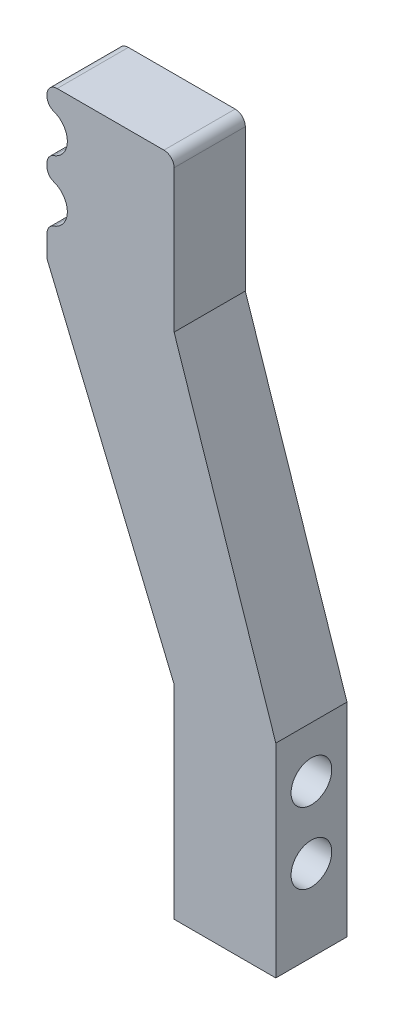
ISO-10303-21;
HEADER;
FILE_DESCRIPTION(('STEP AP214'),'2;1');
FILE_NAME('part.step','',(''),(''),'','','');
FILE_SCHEMA(('AUTOMOTIVE_DESIGN { 1 0 10303 214 1 1 1 1 }'));
ENDSEC;
DATA;
#1=APPLICATION_CONTEXT('core data for automotive mechanical design processes');
#2=APPLICATION_PROTOCOL_DEFINITION('international standard','automotive_design',2000,#1);
#3=PRODUCT_CONTEXT('',#1,'mechanical');
#4=PRODUCT('Part','Part','',(#3));
#5=PRODUCT_RELATED_PRODUCT_CATEGORY('part','',(#4));
#6=PRODUCT_DEFINITION_FORMATION('','',#4);
#7=PRODUCT_DEFINITION_CONTEXT('part definition',#1,'design');
#8=PRODUCT_DEFINITION('design','',#6,#7);
#9=PRODUCT_DEFINITION_SHAPE('','',#8);
#10=(LENGTH_UNIT() NAMED_UNIT(*) SI_UNIT(.MILLI.,.METRE.));
#11=(NAMED_UNIT(*) PLANE_ANGLE_UNIT() SI_UNIT($,.RADIAN.));
#12=(NAMED_UNIT(*) SI_UNIT($,.STERADIAN.) SOLID_ANGLE_UNIT());
#13=UNCERTAINTY_MEASURE_WITH_UNIT(LENGTH_MEASURE(1.E-05),#10,'distance_accuracy_value','');
#14=(GEOMETRIC_REPRESENTATION_CONTEXT(3) GLOBAL_UNCERTAINTY_ASSIGNED_CONTEXT((#13)) GLOBAL_UNIT_ASSIGNED_CONTEXT((#10,
#11,#12)) REPRESENTATION_CONTEXT('',''));
#15=CARTESIAN_POINT('',(0.,0.,0.));
#16=DIRECTION('',(0.,0.,1.));
#17=DIRECTION('',(1.,0.,0.));
#18=AXIS2_PLACEMENT_3D('',#15,#16,#17);
#19=CARTESIAN_POINT('',(-225.084321869179,779.298857863969,70.));
#20=DIRECTION('',(1.,0.,0.));
#21=DIRECTION('',(0.,0.,-1.));
#22=AXIS2_PLACEMENT_3D('',#19,#20,#21);
#23=PLANE('',#22);
#24=DIRECTION('',(0.,0.,1.));
#25=VECTOR('',#24,1.);
#26=CARTESIAN_POINT('',(-225.084321869179,777.583129111431,-122.));
#27=LINE('',#26,#25);
#28=CARTESIAN_POINT('',(-225.084321869179,777.583129111431,0.));
#29=VERTEX_POINT('',#28);
#30=CARTESIAN_POINT('',(-225.084321869179,777.583129111431,70.));
#31=VERTEX_POINT('',#30);
#32=EDGE_CURVE('E311',#29,#31,#27,.T.);
#33=ORIENTED_EDGE('',*,*,#32,.T.);
#34=DIRECTION('',(0.,-1.,0.));
#35=VECTOR('',#34,1.);
#36=CARTESIAN_POINT('',(-225.084321869179,779.298857863969,70.));
#37=LINE('',#36,#35);
#38=CARTESIAN_POINT('',(-225.084321869179,779.298857863969,70.));
#39=VERTEX_POINT('',#38);
#40=EDGE_CURVE('E188',#39,#31,#37,.T.);
#41=ORIENTED_EDGE('',*,*,#40,.F.);
#42=DIRECTION('',(0.,0.,-1.));
#43=VECTOR('',#42,1.);
#44=CARTESIAN_POINT('',(-225.084321869179,779.298857863969,70.));
#45=LINE('',#44,#43);
#46=CARTESIAN_POINT('',(-225.084321869179,779.298857863969,0.));
#47=VERTEX_POINT('',#46);
#48=EDGE_CURVE('E255',#39,#47,#45,.T.);
#49=ORIENTED_EDGE('',*,*,#48,.T.);
#50=DIRECTION('',(0.,-1.,0.));
#51=VECTOR('',#50,1.);
#52=CARTESIAN_POINT('',(-225.084321869179,779.298857863969,0.));
#53=LINE('',#52,#51);
#54=EDGE_CURVE('E218',#47,#29,#53,.T.);
#55=ORIENTED_EDGE('',*,*,#54,.T.);
#56=EDGE_LOOP('',(#33,#41,#49,#55));
#57=FACE_BOUND('',#56,.T.);
#58=ADVANCED_FACE('F39',(#57),#23,.F.);
#59=CARTESIAN_POINT('',(-225.084321869179,721.014586616507,70.));
#60=VERTEX_POINT('',#59);
#61=CARTESIAN_POINT('',(-225.084321869179,717.583129111431,70.));
#62=VERTEX_POINT('',#61);
#63=EDGE_CURVE('E180',#60,#62,#37,.T.);
#64=ORIENTED_EDGE('',*,*,#63,.F.);
#65=DIRECTION('',(0.,0.,1.));
#66=VECTOR('',#65,1.);
#67=CARTESIAN_POINT('',(-225.084321869179,721.014586616507,-122.));
#68=LINE('',#67,#66);
#69=CARTESIAN_POINT('',(-225.084321869179,721.014586616507,0.));
#70=VERTEX_POINT('',#69);
#71=EDGE_CURVE('E162',#70,#60,#68,.T.);
#72=ORIENTED_EDGE('',*,*,#71,.F.);
#73=CARTESIAN_POINT('',(-225.084321869179,717.583129111431,0.));
#74=VERTEX_POINT('',#73);
#75=EDGE_CURVE('E222',#70,#74,#53,.T.);
#76=ORIENTED_EDGE('',*,*,#75,.T.);
#77=DIRECTION('',(0.,0.,1.));
#78=VECTOR('',#77,1.);
#79=CARTESIAN_POINT('',(-225.084321869179,717.583129111431,-122.));
#80=LINE('',#79,#78);
#81=EDGE_CURVE('E187',#74,#62,#80,.T.);
#82=ORIENTED_EDGE('',*,*,#81,.T.);
#83=EDGE_LOOP('',(#64,#72,#76,#82));
#84=FACE_BOUND('',#83,.T.);
#85=ADVANCED_FACE('F186',(#84),#23,.F.);
#86=CARTESIAN_POINT('',(-110.084321869179,779.298857863969,70.));
#87=DIRECTION('',(0.,0.,1.));
#88=DIRECTION('',(1.,0.,0.));
#89=AXIS2_PLACEMENT_3D('',#86,#87,#88);
#90=PLANE('',#89);
#91=CARTESIAN_POINT('',(-215.084321869179,777.583129111431,70.));
#92=DIRECTION('',(0.,0.,-1.));
#93=DIRECTION('',(-1.,0.,0.));
#94=AXIS2_PLACEMENT_3D('',#91,#92,#93);
#95=CIRCLE('',#94,9.99999999999999);
#96=CARTESIAN_POINT('',(-218.417655202512,768.15503869561,70.));
#97=VERTEX_POINT('',#96);
#98=EDGE_CURVE('E314',#97,#31,#95,.T.);
#99=ORIENTED_EDGE('',*,*,#98,.F.);
#100=CARTESIAN_POINT('',(-225.084321869179,749.298857863969,70.));
#101=DIRECTION('',(0.,0.,1.));
#102=DIRECTION('',(1.,0.,0.));
#103=AXIS2_PLACEMENT_3D('',#100,#101,#102);
#104=CIRCLE('',#103,20.);
#105=CARTESIAN_POINT('',(-218.417655202513,730.442677032328,70.));
#106=VERTEX_POINT('',#105);
#107=EDGE_CURVE('E182',#106,#97,#104,.T.);
#108=ORIENTED_EDGE('',*,*,#107,.F.);
#109=CARTESIAN_POINT('',(-215.084321869179,721.014586616507,70.));
#110=DIRECTION('',(0.,0.,-1.));
#111=DIRECTION('',(-1.,0.,0.));
#112=AXIS2_PLACEMENT_3D('',#109,#110,#111);
#113=CIRCLE('',#112,9.99999999999999);
#114=EDGE_CURVE('E165',#60,#106,#113,.T.);
#115=ORIENTED_EDGE('',*,*,#114,.F.);
#116=ORIENTED_EDGE('',*,*,#63,.T.);
#117=CARTESIAN_POINT('',(-215.084321869179,717.583129111431,70.));
#118=DIRECTION('',(0.,0.,-1.));
#119=DIRECTION('',(-1.,0.,0.));
#120=AXIS2_PLACEMENT_3D('',#117,#118,#119);
#121=CIRCLE('',#120,9.99999999999999);
#122=CARTESIAN_POINT('',(-218.417655202512,708.15503869561,70.));
#123=VERTEX_POINT('',#122);
#124=EDGE_CURVE('E183',#123,#62,#121,.T.);
#125=ORIENTED_EDGE('',*,*,#124,.F.);
#126=CARTESIAN_POINT('',(-225.084321869179,689.298857863969,70.));
#127=DIRECTION('',(0.,0.,1.));
#128=DIRECTION('',(1.,0.,0.));
#129=AXIS2_PLACEMENT_3D('',#126,#127,#128);
#130=CIRCLE('',#129,20.);
#131=CARTESIAN_POINT('',(-218.417655202513,670.442677032328,70.));
#132=VERTEX_POINT('',#131);
#133=EDGE_CURVE('E279',#132,#123,#130,.T.);
#134=ORIENTED_EDGE('',*,*,#133,.F.);
#135=CARTESIAN_POINT('',(-215.084321869179,661.014586616507,70.));
#136=DIRECTION('',(0.,0.,-1.));
#137=DIRECTION('',(-1.,0.,0.));
#138=AXIS2_PLACEMENT_3D('',#135,#136,#137);
#139=CIRCLE('',#138,10.);
#140=CARTESIAN_POINT('',(-225.084321869179,661.014586616507,70.));
#141=VERTEX_POINT('',#140);
#142=EDGE_CURVE('E62',#141,#132,#139,.T.);
#143=ORIENTED_EDGE('',*,*,#142,.F.);
#144=CARTESIAN_POINT('',(-225.084321869179,639.298857863969,70.));
#145=VERTEX_POINT('',#144);
#146=EDGE_CURVE('E189',#141,#145,#37,.T.);
#147=ORIENTED_EDGE('',*,*,#146,.T.);
#148=DIRECTION('',(0.384615384615385,-0.923076923076923,0.));
#149=VECTOR('',#148,1.);
#150=CARTESIAN_POINT('',(-100.084321869179,339.298857863969,70.));
#151=LINE('',#150,#149);
#152=CARTESIAN_POINT('',(-100.084321869179,339.298857863969,70.));
#153=VERTEX_POINT('',#152);
#154=EDGE_CURVE('E192',#145,#153,#151,.T.);
#155=ORIENTED_EDGE('',*,*,#154,.T.);
#156=DIRECTION('',(0.,-1.,0.));
#157=VECTOR('',#156,1.);
#158=CARTESIAN_POINT('',(-100.084321869179,339.298857863969,70.));
#159=LINE('',#158,#157);
#160=CARTESIAN_POINT('',(-100.084321869179,139.298857863969,70.));
#161=VERTEX_POINT('',#160);
#162=EDGE_CURVE('E198',#153,#161,#159,.T.);
#163=ORIENTED_EDGE('',*,*,#162,.T.);
#164=DIRECTION('',(1.,0.,0.));
#165=VECTOR('',#164,1.);
#166=CARTESIAN_POINT('',(-0.0843218691791159,139.298857863969,70.));
#167=LINE('',#166,#165);
#168=CARTESIAN_POINT('',(-0.0843218691791159,139.298857863969,70.));
#169=VERTEX_POINT('',#168);
#170=EDGE_CURVE('E200',#161,#169,#167,.T.);
#171=ORIENTED_EDGE('',*,*,#170,.T.);
#172=DIRECTION('',(0.,1.,0.));
#173=VECTOR('',#172,1.);
#174=CARTESIAN_POINT('',(-0.0843218691791426,339.298857863969,70.));
#175=LINE('',#174,#173);
#176=CARTESIAN_POINT('',(-0.0843218691791426,339.298857863969,70.));
#177=VERTEX_POINT('',#176);
#178=EDGE_CURVE('E202',#169,#177,#175,.T.);
#179=ORIENTED_EDGE('',*,*,#178,.T.);
#180=DIRECTION('',(-0.316227766016838,0.948683298050514,0.));
#181=VECTOR('',#180,1.);
#182=CARTESIAN_POINT('',(-0.0843218691791426,339.298857863969,70.));
#183=LINE('',#182,#181);
#184=CARTESIAN_POINT('',(-100.084321869179,639.298857863969,70.));
#185=VERTEX_POINT('',#184);
#186=EDGE_CURVE('E204',#177,#185,#183,.T.);
#187=ORIENTED_EDGE('',*,*,#186,.T.);
#188=DIRECTION('',(0.,1.,0.));
#189=VECTOR('',#188,1.);
#190=CARTESIAN_POINT('',(-100.084321869179,779.298857863969,70.));
#191=LINE('',#190,#189);
#192=CARTESIAN_POINT('',(-100.084321869179,779.298857863969,70.));
#193=VERTEX_POINT('',#192);
#194=EDGE_CURVE('E206',#185,#193,#191,.T.);
#195=ORIENTED_EDGE('',*,*,#194,.T.);
#196=CARTESIAN_POINT('',(-110.084321869179,779.298857863969,70.));
#197=DIRECTION('',(0.,0.,1.));
#198=DIRECTION('',(1.,0.,0.));
#199=AXIS2_PLACEMENT_3D('',#196,#197,#198);
#200=CIRCLE('',#199,10.);
#201=CARTESIAN_POINT('',(-110.084321869179,789.298857863969,70.));
#202=VERTEX_POINT('',#201);
#203=EDGE_CURVE('E234',#193,#202,#200,.T.);
#204=ORIENTED_EDGE('',*,*,#203,.T.);
#205=DIRECTION('',(-1.,0.,0.));
#206=VECTOR('',#205,1.);
#207=CARTESIAN_POINT('',(-215.084321869179,789.298857863969,70.));
#208=LINE('',#207,#206);
#209=CARTESIAN_POINT('',(-215.084321869179,789.298857863969,70.));
#210=VERTEX_POINT('',#209);
#211=EDGE_CURVE('E300',#202,#210,#208,.T.);
#212=ORIENTED_EDGE('',*,*,#211,.T.);
#213=CARTESIAN_POINT('',(-215.084321869179,779.298857863969,70.));
#214=DIRECTION('',(0.,0.,1.));
#215=DIRECTION('',(-1.,0.,0.));
#216=AXIS2_PLACEMENT_3D('',#213,#214,#215);
#217=CIRCLE('',#216,10.);
#218=EDGE_CURVE('E193',#210,#39,#217,.T.);
#219=ORIENTED_EDGE('',*,*,#218,.T.);
#220=ORIENTED_EDGE('',*,*,#40,.T.);
#221=EDGE_LOOP('',(#99,#108,#115,#116,#125,#134,#143,#147,#155,#163,#171,#179,#187,#195,#204,
#212,#219,#220));
#222=FACE_BOUND('',#221,.T.);
#223=ADVANCED_FACE('F178',(#222),#90,.T.);
#224=CARTESIAN_POINT('',(-110.084321869179,779.298857863969,0.));
#225=DIRECTION('',(0.,0.,1.));
#226=DIRECTION('',(1.,0.,0.));
#227=AXIS2_PLACEMENT_3D('',#224,#225,#226);
#228=PLANE('',#227);
#229=CARTESIAN_POINT('',(-225.084321869179,749.298857863969,0.));
#230=DIRECTION('',(0.,0.,1.));
#231=DIRECTION('',(1.,0.,0.));
#232=AXIS2_PLACEMENT_3D('',#229,#230,#231);
#233=CIRCLE('',#232,20.);
#234=CARTESIAN_POINT('',(-218.417655202512,730.442677032328,0.));
#235=VERTEX_POINT('',#234);
#236=CARTESIAN_POINT('',(-218.417655202513,768.15503869561,0.));
#237=VERTEX_POINT('',#236);
#238=EDGE_CURVE('E267',#235,#237,#233,.T.);
#239=ORIENTED_EDGE('',*,*,#238,.T.);
#240=CARTESIAN_POINT('',(-215.084321869179,777.583129111431,0.));
#241=DIRECTION('',(0.,0.,1.));
#242=DIRECTION('',(1.,0.,0.));
#243=AXIS2_PLACEMENT_3D('',#240,#241,#242);
#244=CIRCLE('',#243,9.99999999999999);
#245=EDGE_CURVE('E323',#237,#29,#244,.F.);
#246=ORIENTED_EDGE('',*,*,#245,.T.);
#247=ORIENTED_EDGE('',*,*,#54,.F.);
#248=CARTESIAN_POINT('',(-215.084321869179,779.298857863969,0.));
#249=DIRECTION('',(0.,0.,1.));
#250=DIRECTION('',(-1.,0.,0.));
#251=AXIS2_PLACEMENT_3D('',#248,#249,#250);
#252=CIRCLE('',#251,10.);
#253=CARTESIAN_POINT('',(-215.084321869179,789.298857863969,0.));
#254=VERTEX_POINT('',#253);
#255=EDGE_CURVE('E215',#254,#47,#252,.T.);
#256=ORIENTED_EDGE('',*,*,#255,.F.);
#257=DIRECTION('',(-1.,0.,0.));
#258=VECTOR('',#257,1.);
#259=CARTESIAN_POINT('',(-215.084321869179,789.298857863969,0.));
#260=LINE('',#259,#258);
#261=CARTESIAN_POINT('',(-110.084321869179,789.298857863969,0.));
#262=VERTEX_POINT('',#261);
#263=EDGE_CURVE('E212',#262,#254,#260,.T.);
#264=ORIENTED_EDGE('',*,*,#263,.F.);
#265=CARTESIAN_POINT('',(-110.084321869179,779.298857863969,0.));
#266=DIRECTION('',(0.,0.,1.));
#267=DIRECTION('',(1.,0.,0.));
#268=AXIS2_PLACEMENT_3D('',#265,#266,#267);
#269=CIRCLE('',#268,10.);
#270=CARTESIAN_POINT('',(-100.084321869179,779.298857863969,0.));
#271=VERTEX_POINT('',#270);
#272=EDGE_CURVE('E209',#271,#262,#269,.T.);
#273=ORIENTED_EDGE('',*,*,#272,.F.);
#274=DIRECTION('',(0.,1.,0.));
#275=VECTOR('',#274,1.);
#276=CARTESIAN_POINT('',(-100.084321869179,779.298857863969,0.));
#277=LINE('',#276,#275);
#278=CARTESIAN_POINT('',(-100.084321869179,639.298857863969,0.));
#279=VERTEX_POINT('',#278);
#280=EDGE_CURVE('E232',#279,#271,#277,.T.);
#281=ORIENTED_EDGE('',*,*,#280,.F.);
#282=DIRECTION('',(-0.316227766016838,0.948683298050514,0.));
#283=VECTOR('',#282,1.);
#284=CARTESIAN_POINT('',(-0.0843218691791426,339.298857863969,0.));
#285=LINE('',#284,#283);
#286=CARTESIAN_POINT('',(-0.0843218691791426,339.298857863969,0.));
#287=VERTEX_POINT('',#286);
#288=EDGE_CURVE('E230',#287,#279,#285,.T.);
#289=ORIENTED_EDGE('',*,*,#288,.F.);
#290=DIRECTION('',(0.,1.,0.));
#291=VECTOR('',#290,1.);
#292=CARTESIAN_POINT('',(-0.0843218691791426,339.298857863969,0.));
#293=LINE('',#292,#291);
#294=CARTESIAN_POINT('',(-0.0843218691791159,139.298857863969,0.));
#295=VERTEX_POINT('',#294);
#296=EDGE_CURVE('E228',#295,#287,#293,.T.);
#297=ORIENTED_EDGE('',*,*,#296,.F.);
#298=DIRECTION('',(1.,0.,0.));
#299=VECTOR('',#298,1.);
#300=CARTESIAN_POINT('',(-0.0843218691791159,139.298857863969,0.));
#301=LINE('',#300,#299);
#302=CARTESIAN_POINT('',(-100.084321869179,139.298857863969,0.));
#303=VERTEX_POINT('',#302);
#304=EDGE_CURVE('E226',#303,#295,#301,.T.);
#305=ORIENTED_EDGE('',*,*,#304,.F.);
#306=DIRECTION('',(0.,-1.,0.));
#307=VECTOR('',#306,1.);
#308=CARTESIAN_POINT('',(-100.084321869179,339.298857863969,0.));
#309=LINE('',#308,#307);
#310=CARTESIAN_POINT('',(-100.084321869179,339.298857863969,0.));
#311=VERTEX_POINT('',#310);
#312=EDGE_CURVE('E224',#311,#303,#309,.T.);
#313=ORIENTED_EDGE('',*,*,#312,.F.);
#314=DIRECTION('',(0.384615384615385,-0.923076923076923,0.));
#315=VECTOR('',#314,1.);
#316=CARTESIAN_POINT('',(-100.084321869179,339.298857863969,0.));
#317=LINE('',#316,#315);
#318=CARTESIAN_POINT('',(-225.084321869179,639.298857863969,0.));
#319=VERTEX_POINT('',#318);
#320=EDGE_CURVE('E221',#319,#311,#317,.T.);
#321=ORIENTED_EDGE('',*,*,#320,.F.);
#322=CARTESIAN_POINT('',(-225.084321869179,661.014586616507,0.));
#323=VERTEX_POINT('',#322);
#324=EDGE_CURVE('E217',#323,#319,#53,.T.);
#325=ORIENTED_EDGE('',*,*,#324,.F.);
#326=CARTESIAN_POINT('',(-215.084321869179,661.014586616507,0.));
#327=DIRECTION('',(0.,0.,1.));
#328=DIRECTION('',(1.,0.,0.));
#329=AXIS2_PLACEMENT_3D('',#326,#327,#328);
#330=CIRCLE('',#329,10.);
#331=CARTESIAN_POINT('',(-218.417655202512,670.442677032328,0.));
#332=VERTEX_POINT('',#331);
#333=EDGE_CURVE('E282',#323,#332,#330,.F.);
#334=ORIENTED_EDGE('',*,*,#333,.T.);
#335=CARTESIAN_POINT('',(-225.084321869179,689.298857863969,0.));
#336=DIRECTION('',(0.,0.,1.));
#337=DIRECTION('',(1.,0.,0.));
#338=AXIS2_PLACEMENT_3D('',#335,#336,#337);
#339=CIRCLE('',#338,20.);
#340=CARTESIAN_POINT('',(-218.417655202512,708.15503869561,0.));
#341=VERTEX_POINT('',#340);
#342=EDGE_CURVE('E264',#332,#341,#339,.T.);
#343=ORIENTED_EDGE('',*,*,#342,.T.);
#344=CARTESIAN_POINT('',(-215.084321869179,717.583129111431,0.));
#345=DIRECTION('',(0.,0.,1.));
#346=DIRECTION('',(1.,0.,0.));
#347=AXIS2_PLACEMENT_3D('',#344,#345,#346);
#348=CIRCLE('',#347,9.99999999999999);
#349=EDGE_CURVE('E54',#341,#74,#348,.F.);
#350=ORIENTED_EDGE('',*,*,#349,.T.);
#351=ORIENTED_EDGE('',*,*,#75,.F.);
#352=CARTESIAN_POINT('',(-215.084321869179,721.014586616507,0.));
#353=DIRECTION('',(0.,0.,1.));
#354=DIRECTION('',(1.,0.,0.));
#355=AXIS2_PLACEMENT_3D('',#352,#353,#354);
#356=CIRCLE('',#355,9.99999999999999);
#357=EDGE_CURVE('E168',#70,#235,#356,.F.);
#358=ORIENTED_EDGE('',*,*,#357,.T.);
#359=EDGE_LOOP('',(#239,#246,#247,#256,#264,#273,#281,#289,#297,#305,#313,#321,#325,#334,#343,
#350,#351,#358));
#360=FACE_BOUND('',#359,.T.);
#361=ADVANCED_FACE('F326',(#360),#228,.F.);
#362=CARTESIAN_POINT('',(-225.084321869179,689.298857863969,-122.));
#363=DIRECTION('',(0.,0.,1.));
#364=DIRECTION('',(1.,0.,0.));
#365=AXIS2_PLACEMENT_3D('',#362,#363,#364);
#366=CYLINDRICAL_SURFACE('',#365,20.);
#367=ORIENTED_EDGE('',*,*,#342,.F.);
#368=DIRECTION('',(0.,0.,1.));
#369=VECTOR('',#368,1.);
#370=CARTESIAN_POINT('',(-218.417655202513,670.442677032328,-122.));
#371=LINE('',#370,#369);
#372=EDGE_CURVE('E11',#332,#132,#371,.T.);
#373=ORIENTED_EDGE('',*,*,#372,.T.);
#374=ORIENTED_EDGE('',*,*,#133,.T.);
#375=DIRECTION('',(0.,0.,1.));
#376=VECTOR('',#375,1.);
#377=CARTESIAN_POINT('',(-218.417655202512,708.15503869561,-26.));
#378=LINE('',#377,#376);
#379=EDGE_CURVE('E47',#341,#123,#378,.T.);
#380=ORIENTED_EDGE('',*,*,#379,.F.);
#381=EDGE_LOOP('',(#367,#373,#374,#380));
#382=FACE_BOUND('',#381,.T.);
#383=ADVANCED_FACE('F281',(#382),#366,.F.);
#384=CARTESIAN_POINT('',(-110.084321869179,779.298857863969,70.));
#385=DIRECTION('',(0.,0.,-1.));
#386=DIRECTION('',(-1.,0.,0.));
#387=AXIS2_PLACEMENT_3D('',#384,#385,#386);
#388=CYLINDRICAL_SURFACE('',#387,10.);
#389=ORIENTED_EDGE('',*,*,#272,.T.);
#390=DIRECTION('',(0.,0.,-1.));
#391=VECTOR('',#390,1.);
#392=CARTESIAN_POINT('',(-110.084321869179,789.298857863969,70.));
#393=LINE('',#392,#391);
#394=EDGE_CURVE('E261',#202,#262,#393,.T.);
#395=ORIENTED_EDGE('',*,*,#394,.F.);
#396=ORIENTED_EDGE('',*,*,#203,.F.);
#397=DIRECTION('',(0.,0.,-1.));
#398=VECTOR('',#397,1.);
#399=CARTESIAN_POINT('',(-100.084321869179,779.298857863969,70.));
#400=LINE('',#399,#398);
#401=EDGE_CURVE('E208',#193,#271,#400,.T.);
#402=ORIENTED_EDGE('',*,*,#401,.T.);
#403=EDGE_LOOP('',(#389,#395,#396,#402));
#404=FACE_BOUND('',#403,.T.);
#405=ADVANCED_FACE('F41',(#404),#388,.T.);
#406=CARTESIAN_POINT('',(-215.084321869179,789.298857863969,70.));
#407=DIRECTION('',(0.,-1.,0.));
#408=DIRECTION('',(0.,0.,-1.));
#409=AXIS2_PLACEMENT_3D('',#406,#407,#408);
#410=PLANE('',#409);
#411=ORIENTED_EDGE('',*,*,#263,.T.);
#412=DIRECTION('',(0.,0.,-1.));
#413=VECTOR('',#412,1.);
#414=CARTESIAN_POINT('',(-215.084321869179,789.298857863969,70.));
#415=LINE('',#414,#413);
#416=EDGE_CURVE('E258',#210,#254,#415,.T.);
#417=ORIENTED_EDGE('',*,*,#416,.F.);
#418=ORIENTED_EDGE('',*,*,#211,.F.);
#419=ORIENTED_EDGE('',*,*,#394,.T.);
#420=EDGE_LOOP('',(#411,#417,#418,#419));
#421=FACE_BOUND('',#420,.T.);
#422=ADVANCED_FACE('F376',(#421),#410,.F.);
#423=CARTESIAN_POINT('',(-215.084321869179,779.298857863969,70.));
#424=DIRECTION('',(0.,0.,-1.));
#425=DIRECTION('',(-1.,0.,0.));
#426=AXIS2_PLACEMENT_3D('',#423,#424,#425);
#427=CYLINDRICAL_SURFACE('',#426,10.);
#428=ORIENTED_EDGE('',*,*,#255,.T.);
#429=ORIENTED_EDGE('',*,*,#48,.F.);
#430=ORIENTED_EDGE('',*,*,#218,.F.);
#431=ORIENTED_EDGE('',*,*,#416,.T.);
#432=EDGE_LOOP('',(#428,#429,#430,#431));
#433=FACE_BOUND('',#432,.T.);
#434=ADVANCED_FACE('F306',(#433),#427,.T.);
#435=ORIENTED_EDGE('',*,*,#146,.F.);
#436=DIRECTION('',(0.,0.,1.));
#437=VECTOR('',#436,1.);
#438=CARTESIAN_POINT('',(-225.084321869179,661.014586616507,-122.));
#439=LINE('',#438,#437);
#440=EDGE_CURVE('E316',#323,#141,#439,.T.);
#441=ORIENTED_EDGE('',*,*,#440,.F.);
#442=ORIENTED_EDGE('',*,*,#324,.T.);
#443=DIRECTION('',(0.,0.,-1.));
#444=VECTOR('',#443,1.);
#445=CARTESIAN_POINT('',(-225.084321869179,639.298857863969,70.));
#446=LINE('',#445,#444);
#447=EDGE_CURVE('E252',#145,#319,#446,.T.);
#448=ORIENTED_EDGE('',*,*,#447,.F.);
#449=EDGE_LOOP('',(#435,#441,#442,#448));
#450=FACE_BOUND('',#449,.T.);
#451=ADVANCED_FACE('F332',(#450),#23,.F.);
#452=CARTESIAN_POINT('',(-100.084321869179,339.298857863969,70.));
#453=DIRECTION('',(0.923076923076923,0.384615384615385,0.));
#454=DIRECTION('',(-0.384615384615385,0.923076923076923,0.));
#455=AXIS2_PLACEMENT_3D('',#452,#453,#454);
#456=PLANE('',#455);
#457=ORIENTED_EDGE('',*,*,#320,.T.);
#458=DIRECTION('',(0.,0.,-1.));
#459=VECTOR('',#458,1.);
#460=CARTESIAN_POINT('',(-100.084321869179,339.298857863969,70.));
#461=LINE('',#460,#459);
#462=EDGE_CURVE('E249',#153,#311,#461,.T.);
#463=ORIENTED_EDGE('',*,*,#462,.F.);
#464=ORIENTED_EDGE('',*,*,#154,.F.);
#465=ORIENTED_EDGE('',*,*,#447,.T.);
#466=EDGE_LOOP('',(#457,#463,#464,#465));
#467=FACE_BOUND('',#466,.T.);
#468=ADVANCED_FACE('F336',(#467),#456,.F.);
#469=CARTESIAN_POINT('',(-100.084321869179,339.298857863969,70.));
#470=DIRECTION('',(1.,0.,0.));
#471=DIRECTION('',(0.,0.,-1.));
#472=AXIS2_PLACEMENT_3D('',#469,#470,#471);
#473=PLANE('',#472);
#474=CARTESIAN_POINT('',(-100.084321869179,289.298857863969,35.));
#475=DIRECTION('',(1.,0.,0.));
#476=DIRECTION('',(0.,0.,-1.));
#477=AXIS2_PLACEMENT_3D('',#474,#475,#476);
#478=CIRCLE('',#477,20.);
#479=CARTESIAN_POINT('',(-100.084321869179,289.298857863969,15.));
#480=VERTEX_POINT('',#479);
#481=EDGE_CURVE('E213',#480,#480,#478,.T.);
#482=ORIENTED_EDGE('',*,*,#481,.T.);
#483=EDGE_LOOP('',(#482));
#484=FACE_BOUND('',#483,.T.);
#485=CARTESIAN_POINT('',(-100.084321869179,219.298857863969,35.0000000000001));
#486=DIRECTION('',(1.,0.,0.));
#487=DIRECTION('',(0.,0.,-1.));
#488=AXIS2_PLACEMENT_3D('',#485,#486,#487);
#489=CIRCLE('',#488,20.);
#490=CARTESIAN_POINT('',(-100.084321869179,219.298857863969,15.0000000000001));
#491=VERTEX_POINT('',#490);
#492=EDGE_CURVE('E292',#491,#491,#489,.T.);
#493=ORIENTED_EDGE('',*,*,#492,.T.);
#494=EDGE_LOOP('',(#493));
#495=FACE_BOUND('',#494,.T.);
#496=ORIENTED_EDGE('',*,*,#312,.T.);
#497=DIRECTION('',(0.,0.,-1.));
#498=VECTOR('',#497,1.);
#499=CARTESIAN_POINT('',(-100.084321869179,139.298857863969,70.));
#500=LINE('',#499,#498);
#501=EDGE_CURVE('E246',#161,#303,#500,.T.);
#502=ORIENTED_EDGE('',*,*,#501,.F.);
#503=ORIENTED_EDGE('',*,*,#162,.F.);
#504=ORIENTED_EDGE('',*,*,#462,.T.);
#505=EDGE_LOOP('',(#496,#502,#503,#504));
#506=FACE_BOUND('',#505,.T.);
#507=ADVANCED_FACE('F343',(#484,#495,#506),#473,.F.);
#508=CARTESIAN_POINT('',(-0.0843218691791159,139.298857863969,70.));
#509=DIRECTION('',(0.,1.,0.));
#510=DIRECTION('',(0.,0.,1.));
#511=AXIS2_PLACEMENT_3D('',#508,#509,#510);
#512=PLANE('',#511);
#513=ORIENTED_EDGE('',*,*,#304,.T.);
#514=DIRECTION('',(0.,0.,-1.));
#515=VECTOR('',#514,1.);
#516=CARTESIAN_POINT('',(-0.0843218691791159,139.298857863969,70.));
#517=LINE('',#516,#515);
#518=EDGE_CURVE('E243',#169,#295,#517,.T.);
#519=ORIENTED_EDGE('',*,*,#518,.F.);
#520=ORIENTED_EDGE('',*,*,#170,.F.);
#521=ORIENTED_EDGE('',*,*,#501,.T.);
#522=EDGE_LOOP('',(#513,#519,#520,#521));
#523=FACE_BOUND('',#522,.T.);
#524=ADVANCED_FACE('F347',(#523),#512,.F.);
#525=CARTESIAN_POINT('',(-0.0843218691791426,339.298857863969,70.));
#526=DIRECTION('',(-1.,0.,0.));
#527=DIRECTION('',(0.,-1.,0.));
#528=AXIS2_PLACEMENT_3D('',#525,#526,#527);
#529=PLANE('',#528);
#530=CARTESIAN_POINT('',(-0.0843218691791359,289.298857863969,35.));
#531=DIRECTION('',(1.,0.,0.));
#532=DIRECTION('',(0.,1.,0.));
#533=AXIS2_PLACEMENT_3D('',#530,#531,#532);
#534=CIRCLE('',#533,20.);
#535=CARTESIAN_POINT('',(-0.0843218691791386,309.298857863969,35.));
#536=VERTEX_POINT('',#535);
#537=EDGE_CURVE('E289',#536,#536,#534,.T.);
#538=ORIENTED_EDGE('',*,*,#537,.F.);
#539=EDGE_LOOP('',(#538));
#540=FACE_BOUND('',#539,.T.);
#541=CARTESIAN_POINT('',(-0.0843218691791266,219.298857863969,35.0000000000001));
#542=DIRECTION('',(1.,0.,0.));
#543=DIRECTION('',(0.,1.,0.));
#544=AXIS2_PLACEMENT_3D('',#541,#542,#543);
#545=CIRCLE('',#544,20.);
#546=CARTESIAN_POINT('',(-0.0843218691791292,239.298857863969,35.0000000000001));
#547=VERTEX_POINT('',#546);
#548=EDGE_CURVE('E284',#547,#547,#545,.T.);
#549=ORIENTED_EDGE('',*,*,#548,.F.);
#550=EDGE_LOOP('',(#549));
#551=FACE_BOUND('',#550,.T.);
#552=ORIENTED_EDGE('',*,*,#296,.T.);
#553=DIRECTION('',(0.,0.,-1.));
#554=VECTOR('',#553,1.);
#555=CARTESIAN_POINT('',(-0.0843218691791426,339.298857863969,70.));
#556=LINE('',#555,#554);
#557=EDGE_CURVE('E240',#177,#287,#556,.T.);
#558=ORIENTED_EDGE('',*,*,#557,.F.);
#559=ORIENTED_EDGE('',*,*,#178,.F.);
#560=ORIENTED_EDGE('',*,*,#518,.T.);
#561=EDGE_LOOP('',(#552,#558,#559,#560));
#562=FACE_BOUND('',#561,.T.);
#563=ADVANCED_FACE('F414',(#540,#551,#562),#529,.F.);
#564=CARTESIAN_POINT('',(-0.0843218691791426,339.298857863969,70.));
#565=DIRECTION('',(-0.948683298050514,-0.316227766016838,0.));
#566=DIRECTION('',(0.316227766016838,-0.948683298050514,0.));
#567=AXIS2_PLACEMENT_3D('',#564,#565,#566);
#568=PLANE('',#567);
#569=ORIENTED_EDGE('',*,*,#288,.T.);
#570=DIRECTION('',(0.,0.,-1.));
#571=VECTOR('',#570,1.);
#572=CARTESIAN_POINT('',(-100.084321869179,639.298857863969,70.));
#573=LINE('',#572,#571);
#574=EDGE_CURVE('E237',#185,#279,#573,.T.);
#575=ORIENTED_EDGE('',*,*,#574,.F.);
#576=ORIENTED_EDGE('',*,*,#186,.F.);
#577=ORIENTED_EDGE('',*,*,#557,.T.);
#578=EDGE_LOOP('',(#569,#575,#576,#577));
#579=FACE_BOUND('',#578,.T.);
#580=ADVANCED_FACE('F410',(#579),#568,.F.);
#581=CARTESIAN_POINT('',(-100.084321869179,779.298857863969,70.));
#582=DIRECTION('',(-1.,0.,0.));
#583=DIRECTION('',(0.,0.,1.));
#584=AXIS2_PLACEMENT_3D('',#581,#582,#583);
#585=PLANE('',#584);
#586=ORIENTED_EDGE('',*,*,#280,.T.);
#587=ORIENTED_EDGE('',*,*,#401,.F.);
#588=ORIENTED_EDGE('',*,*,#194,.F.);
#589=ORIENTED_EDGE('',*,*,#574,.T.);
#590=EDGE_LOOP('',(#586,#587,#588,#589));
#591=FACE_BOUND('',#590,.T.);
#592=ADVANCED_FACE('F402',(#591),#585,.F.);
#593=CARTESIAN_POINT('',(-192.084321869179,219.298857863969,35.0000000000001));
#594=DIRECTION('',(1.,0.,0.));
#595=DIRECTION('',(0.,1.,0.));
#596=AXIS2_PLACEMENT_3D('',#593,#594,#595);
#597=CYLINDRICAL_SURFACE('',#596,20.);
#598=ORIENTED_EDGE('',*,*,#548,.T.);
#599=EDGE_LOOP('',(#598));
#600=FACE_BOUND('',#599,.T.);
#601=ORIENTED_EDGE('',*,*,#492,.F.);
#602=EDGE_LOOP('',(#601));
#603=FACE_BOUND('',#602,.T.);
#604=ADVANCED_FACE('F395',(#600,#603),#597,.F.);
#605=CARTESIAN_POINT('',(-192.084321869179,289.298857863969,35.));
#606=DIRECTION('',(1.,0.,0.));
#607=DIRECTION('',(0.,1.,0.));
#608=AXIS2_PLACEMENT_3D('',#605,#606,#607);
#609=CYLINDRICAL_SURFACE('',#608,20.);
#610=ORIENTED_EDGE('',*,*,#537,.T.);
#611=EDGE_LOOP('',(#610));
#612=FACE_BOUND('',#611,.T.);
#613=ORIENTED_EDGE('',*,*,#481,.F.);
#614=EDGE_LOOP('',(#613));
#615=FACE_BOUND('',#614,.T.);
#616=ADVANCED_FACE('F390',(#612,#615),#609,.F.);
#617=CARTESIAN_POINT('',(-225.084321869179,749.298857863969,-122.));
#618=DIRECTION('',(0.,0.,1.));
#619=DIRECTION('',(1.,0.,0.));
#620=AXIS2_PLACEMENT_3D('',#617,#618,#619);
#621=CYLINDRICAL_SURFACE('',#620,20.);
#622=ORIENTED_EDGE('',*,*,#107,.T.);
#623=DIRECTION('',(0.,0.,1.));
#624=VECTOR('',#623,1.);
#625=CARTESIAN_POINT('',(-218.417655202513,768.15503869561,-122.));
#626=LINE('',#625,#624);
#627=EDGE_CURVE('E272',#97,#237,#626,.F.);
#628=ORIENTED_EDGE('',*,*,#627,.T.);
#629=ORIENTED_EDGE('',*,*,#238,.F.);
#630=DIRECTION('',(0.,0.,1.));
#631=VECTOR('',#630,1.);
#632=CARTESIAN_POINT('',(-218.417655202512,730.442677032328,-26.));
#633=LINE('',#632,#631);
#634=EDGE_CURVE('E270',#235,#106,#633,.T.);
#635=ORIENTED_EDGE('',*,*,#634,.T.);
#636=EDGE_LOOP('',(#622,#628,#629,#635));
#637=FACE_BOUND('',#636,.T.);
#638=ADVANCED_FACE('F389',(#637),#621,.F.);
#639=CARTESIAN_POINT('',(-215.084321869179,721.014586616507,-122.));
#640=DIRECTION('',(0.,0.,1.));
#641=DIRECTION('',(1.,0.,0.));
#642=AXIS2_PLACEMENT_3D('',#639,#640,#641);
#643=CYLINDRICAL_SURFACE('',#642,9.99999999999999);
#644=ORIENTED_EDGE('',*,*,#71,.T.);
#645=ORIENTED_EDGE('',*,*,#114,.T.);
#646=ORIENTED_EDGE('',*,*,#634,.F.);
#647=ORIENTED_EDGE('',*,*,#357,.F.);
#648=EDGE_LOOP('',(#644,#645,#646,#647));
#649=FACE_BOUND('',#648,.T.);
#650=ADVANCED_FACE('F164',(#649),#643,.T.);
#651=CARTESIAN_POINT('',(-215.084321869179,777.583129111431,-122.));
#652=DIRECTION('',(0.,0.,1.));
#653=DIRECTION('',(1.,0.,0.));
#654=AXIS2_PLACEMENT_3D('',#651,#652,#653);
#655=CYLINDRICAL_SURFACE('',#654,9.99999999999999);
#656=ORIENTED_EDGE('',*,*,#627,.F.);
#657=ORIENTED_EDGE('',*,*,#98,.T.);
#658=ORIENTED_EDGE('',*,*,#32,.F.);
#659=ORIENTED_EDGE('',*,*,#245,.F.);
#660=EDGE_LOOP('',(#656,#657,#658,#659));
#661=FACE_BOUND('',#660,.T.);
#662=ADVANCED_FACE('F357',(#661),#655,.T.);
#663=CARTESIAN_POINT('',(-215.084321869179,717.583129111431,-122.));
#664=DIRECTION('',(0.,0.,1.));
#665=DIRECTION('',(1.,0.,0.));
#666=AXIS2_PLACEMENT_3D('',#663,#664,#665);
#667=CYLINDRICAL_SURFACE('',#666,9.99999999999999);
#668=ORIENTED_EDGE('',*,*,#379,.T.);
#669=ORIENTED_EDGE('',*,*,#124,.T.);
#670=ORIENTED_EDGE('',*,*,#81,.F.);
#671=ORIENTED_EDGE('',*,*,#349,.F.);
#672=EDGE_LOOP('',(#668,#669,#670,#671));
#673=FACE_BOUND('',#672,.T.);
#674=ADVANCED_FACE('F274',(#673),#667,.T.);
#675=CARTESIAN_POINT('',(-215.084321869179,661.014586616507,-122.));
#676=DIRECTION('',(0.,0.,1.));
#677=DIRECTION('',(1.,0.,0.));
#678=AXIS2_PLACEMENT_3D('',#675,#676,#677);
#679=CYLINDRICAL_SURFACE('',#678,10.);
#680=ORIENTED_EDGE('',*,*,#440,.T.);
#681=ORIENTED_EDGE('',*,*,#142,.T.);
#682=ORIENTED_EDGE('',*,*,#372,.F.);
#683=ORIENTED_EDGE('',*,*,#333,.F.);
#684=EDGE_LOOP('',(#680,#681,#682,#683));
#685=FACE_BOUND('',#684,.T.);
#686=ADVANCED_FACE('F351',(#685),#679,.T.);
#687=CLOSED_SHELL('',(#58,#85,#223,#361,#383,#405,#422,#434,#451,#468,#507,#524,#563,#580,#592,
#604,#616,#638,#650,#662,#674,#686));
#688=MANIFOLD_SOLID_BREP('B2',#687);
#689=ADVANCED_BREP_SHAPE_REPRESENTATION('',(#18,#688),#14);
#690=SHAPE_DEFINITION_REPRESENTATION(#9,#689);
ENDSEC;
END-ISO-10303-21;
